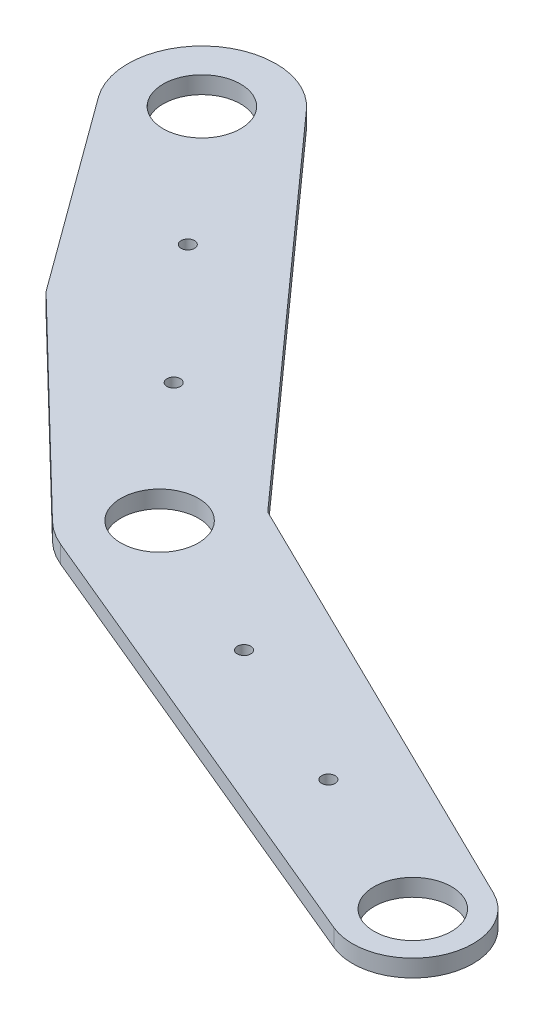
ISO-10303-21;
HEADER;
FILE_DESCRIPTION(('STEP AP214'),'2;1');
FILE_NAME('part.step','',(''),(''),'','','');
FILE_SCHEMA(('AUTOMOTIVE_DESIGN { 1 0 10303 214 1 1 1 1 }'));
ENDSEC;
DATA;
#1=APPLICATION_CONTEXT('core data for automotive mechanical design processes');
#2=APPLICATION_PROTOCOL_DEFINITION('international standard','automotive_design',2000,#1);
#3=PRODUCT_CONTEXT('',#1,'mechanical');
#4=PRODUCT('Part','Part','',(#3));
#5=PRODUCT_RELATED_PRODUCT_CATEGORY('part','',(#4));
#6=PRODUCT_DEFINITION_FORMATION('','',#4);
#7=PRODUCT_DEFINITION_CONTEXT('part definition',#1,'design');
#8=PRODUCT_DEFINITION('design','',#6,#7);
#9=PRODUCT_DEFINITION_SHAPE('','',#8);
#10=(LENGTH_UNIT() NAMED_UNIT(*) SI_UNIT(.MILLI.,.METRE.));
#11=(NAMED_UNIT(*) PLANE_ANGLE_UNIT() SI_UNIT($,.RADIAN.));
#12=(NAMED_UNIT(*) SI_UNIT($,.STERADIAN.) SOLID_ANGLE_UNIT());
#13=UNCERTAINTY_MEASURE_WITH_UNIT(LENGTH_MEASURE(1.E-05),#10,'distance_accuracy_value','');
#14=(GEOMETRIC_REPRESENTATION_CONTEXT(3) GLOBAL_UNCERTAINTY_ASSIGNED_CONTEXT((#13)) GLOBAL_UNIT_ASSIGNED_CONTEXT((#10,
#11,#12)) REPRESENTATION_CONTEXT('',''));
#15=CARTESIAN_POINT('',(0.,0.,0.));
#16=DIRECTION('',(0.,0.,1.));
#17=DIRECTION('',(1.,0.,0.));
#18=AXIS2_PLACEMENT_3D('',#15,#16,#17);
#19=CARTESIAN_POINT('',(75.095230672892,6.35,34.29));
#20=DIRECTION('',(0.,1.,0.));
#21=DIRECTION('',(0.,0.,1.));
#22=AXIS2_PLACEMENT_3D('',#19,#20,#21);
#23=PLANE('',#22);
#24=CARTESIAN_POINT('',(158.10251971021,6.35,127.69346365907));
#25=DIRECTION('',(0.,1.,0.));
#26=DIRECTION('',(0.,0.,1.));
#27=AXIS2_PLACEMENT_3D('',#24,#25,#26);
#28=CIRCLE('',#27,2.48919999999997);
#29=CARTESIAN_POINT('',(158.10251971021,6.35,130.18266365907));
#30=VERTEX_POINT('',#29);
#31=EDGE_CURVE('E424',#30,#30,#28,.T.);
#32=ORIENTED_EDGE('',*,*,#31,.F.);
#33=EDGE_LOOP('',(#32));
#34=FACE_BOUND('',#33,.T.);
#35=CARTESIAN_POINT('',(313.427710588494,6.35,225.96140300338));
#36=DIRECTION('',(0.,1.,0.));
#37=DIRECTION('',(0.,0.,1.));
#38=AXIS2_PLACEMENT_3D('',#35,#36,#37);
#39=CIRCLE('',#38,2.48920000000001);
#40=CARTESIAN_POINT('',(313.427710588494,6.35,228.45060300338));
#41=VERTEX_POINT('',#40);
#42=EDGE_CURVE('E436',#41,#41,#39,.T.);
#43=ORIENTED_EDGE('',*,*,#42,.F.);
#44=EDGE_LOOP('',(#43));
#45=FACE_BOUND('',#44,.T.);
#46=CARTESIAN_POINT('',(199.606167476883,6.35,174.395199143412));
#47=DIRECTION('',(0.,1.,0.));
#48=DIRECTION('',(0.,0.,1.));
#49=AXIS2_PLACEMENT_3D('',#46,#47,#48);
#50=CIRCLE('',#49,14.2875);
#51=CARTESIAN_POINT('',(199.606167476883,6.35,188.682699143413));
#52=VERTEX_POINT('',#51);
#53=EDGE_CURVE('E448',#52,#52,#50,.T.);
#54=ORIENTED_EDGE('',*,*,#53,.F.);
#55=EDGE_LOOP('',(#54));
#56=FACE_BOUND('',#55,.T.);
#57=CARTESIAN_POINT('',(75.095230672892,6.35,34.29));
#58=DIRECTION('',(0.,1.,0.));
#59=DIRECTION('',(0.,0.,1.));
#60=AXIS2_PLACEMENT_3D('',#57,#58,#59);
#61=CIRCLE('',#60,27.305);
#62=CARTESIAN_POINT('',(95.4436302013595,6.35,16.0827030663565));
#63=VERTEX_POINT('',#62);
#64=CARTESIAN_POINT('',(53.0501244379253,6.35,50.4013722596504));
#65=VERTEX_POINT('',#64);
#66=EDGE_CURVE('E283',#63,#65,#61,.T.);
#67=ORIENTED_EDGE('',*,*,#66,.T.);
#68=DIRECTION('',(-0.590052087883187,0.,-0.807365179819325));
#69=VECTOR('',#68,1.);
#70=CARTESIAN_POINT('',(105.505755050741,6.35,122.176136745588));
#71=LINE('',#70,#69);
#72=CARTESIAN_POINT('',(105.505755050741,6.35,122.176136745588));
#73=VERTEX_POINT('',#72);
#74=EDGE_CURVE('E365',#73,#65,#71,.T.);
#75=ORIENTED_EDGE('',*,*,#74,.F.);
#76=DIRECTION('',(0.718432921931401,0.,0.6955962454507));
#77=VECTOR('',#76,1.);
#78=CARTESIAN_POINT('',(105.505755050741,6.35,122.176136745588));
#79=LINE('',#78,#77);
#80=CARTESIAN_POINT('',(180.17120837899,6.35,194.468214982176));
#81=VERTEX_POINT('',#80);
#82=EDGE_CURVE('E355',#73,#81,#79,.T.);
#83=ORIENTED_EDGE('',*,*,#82,.T.);
#84=CARTESIAN_POINT('',(199.606167476883,6.35,174.395199143412));
#85=DIRECTION('',(0.,1.,0.));
#86=DIRECTION('',(0.,0.,1.));
#87=AXIS2_PLACEMENT_3D('',#84,#85,#86);
#88=CIRCLE('',#87,27.94);
#89=CARTESIAN_POINT('',(188.857524144362,6.35,200.18493094718));
#90=VERTEX_POINT('',#89);
#91=EDGE_CURVE('E461',#81,#90,#88,.T.);
#92=ORIENTED_EDGE('',*,*,#91,.T.);
#93=DIRECTION('',(0.923039792547152,0.,0.384704485773834));
#94=VECTOR('',#93,1.);
#95=CARTESIAN_POINT('',(188.857524144362,6.35,200.18493094718));
#96=LINE('',#95,#94);
#97=CARTESIAN_POINT('',(361.788429401728,6.35,272.259066340471));
#98=VERTEX_POINT('',#97);
#99=EDGE_CURVE('E304',#90,#98,#96,.T.);
#100=ORIENTED_EDGE('',*,*,#99,.T.);
#101=CARTESIAN_POINT('',(370.338486598052,6.35,251.744506951111));
#102=DIRECTION('',(0.,1.,0.));
#103=DIRECTION('',(0.,0.,1.));
#104=AXIS2_PLACEMENT_3D('',#101,#102,#103);
#105=CIRCLE('',#104,22.225);
#106=CARTESIAN_POINT('',(380.123056101168,6.35,231.789236353128));
#107=VERTEX_POINT('',#106);
#108=EDGE_CURVE('E298',#98,#107,#105,.T.);
#109=ORIENTED_EDGE('',*,*,#108,.T.);
#110=DIRECTION('',(-0.897874942541384,0.,-0.440250596315674));
#111=VECTOR('',#110,1.);
#112=CARTESIAN_POINT('',(380.123056101168,6.35,231.789236353128));
#113=LINE('',#112,#111);
#114=CARTESIAN_POINT('',(216.796442467324,6.35,151.706102678635));
#115=VERTEX_POINT('',#114);
#116=EDGE_CURVE('E302',#107,#115,#113,.T.);
#117=ORIENTED_EDGE('',*,*,#116,.T.);
#118=DIRECTION('',(0.666811826905092,0.,0.745226131787858));
#119=VECTOR('',#118,1.);
#120=CARTESIAN_POINT('',(95.4436302013595,6.35,16.0827030663565));
#121=LINE('',#120,#119);
#122=EDGE_CURVE('E319',#63,#115,#121,.T.);
#123=ORIENTED_EDGE('',*,*,#122,.F.);
#124=EDGE_LOOP('',(#67,#75,#83,#92,#100,#109,#117,#123));
#125=FACE_BOUND('',#124,.T.);
#126=CARTESIAN_POINT('',(75.095230672892,6.35,34.29));
#127=DIRECTION('',(0.,1.,0.));
#128=DIRECTION('',(0.,0.,1.));
#129=AXIS2_PLACEMENT_3D('',#126,#127,#128);
#130=CIRCLE('',#129,14.2875);
#131=CARTESIAN_POINT('',(75.095230672892,6.35,48.5775));
#132=VERTEX_POINT('',#131);
#133=EDGE_CURVE('E327',#132,#132,#130,.T.);
#134=ORIENTED_EDGE('',*,*,#133,.F.);
#135=EDGE_LOOP('',(#134));
#136=FACE_BOUND('',#135,.T.);
#137=CARTESIAN_POINT('',(370.338486598052,6.35,251.744506951111));
#138=DIRECTION('',(0.,1.,0.));
#139=DIRECTION('',(0.,0.,1.));
#140=AXIS2_PLACEMENT_3D('',#137,#138,#139);
#141=CIRCLE('',#140,14.2875000000001);
#142=CARTESIAN_POINT('',(370.338486598052,6.35,266.032006951111));
#143=VERTEX_POINT('',#142);
#144=EDGE_CURVE('E442',#143,#143,#141,.T.);
#145=ORIENTED_EDGE('',*,*,#144,.F.);
#146=EDGE_LOOP('',(#145));
#147=FACE_BOUND('',#146,.T.);
#148=CARTESIAN_POINT('',(256.516951121444,6.35,200.178306550138));
#149=DIRECTION('',(0.,1.,0.));
#150=DIRECTION('',(0.,0.,1.));
#151=AXIS2_PLACEMENT_3D('',#148,#149,#150);
#152=CIRCLE('',#151,2.48920000000001);
#153=CARTESIAN_POINT('',(256.516951121444,6.35,202.667506550138));
#154=VERTEX_POINT('',#153);
#155=EDGE_CURVE('E430',#154,#154,#152,.T.);
#156=ORIENTED_EDGE('',*,*,#155,.F.);
#157=EDGE_LOOP('',(#156));
#158=FACE_BOUND('',#157,.T.);
#159=CARTESIAN_POINT('',(116.598878439564,6.35,80.9917354843427));
#160=DIRECTION('',(0.,1.,0.));
#161=DIRECTION('',(0.,0.,1.));
#162=AXIS2_PLACEMENT_3D('',#159,#160,#161);
#163=CIRCLE('',#162,2.4892);
#164=CARTESIAN_POINT('',(116.598878439564,6.35,83.4809354843427));
#165=VERTEX_POINT('',#164);
#166=EDGE_CURVE('E415',#165,#165,#163,.T.);
#167=ORIENTED_EDGE('',*,*,#166,.F.);
#168=EDGE_LOOP('',(#167));
#169=FACE_BOUND('',#168,.T.);
#170=ADVANCED_FACE('F228',(#34,#45,#56,#125,#136,#147,#158,#169),#23,.T.);
#171=CARTESIAN_POINT('',(75.095230672892,0.,34.29));
#172=DIRECTION('',(0.,1.,0.));
#173=DIRECTION('',(0.,0.,1.));
#174=AXIS2_PLACEMENT_3D('',#171,#172,#173);
#175=PLANE('',#174);
#176=CARTESIAN_POINT('',(75.095230672892,0.,34.29));
#177=DIRECTION('',(0.,1.,0.));
#178=DIRECTION('',(0.,0.,1.));
#179=AXIS2_PLACEMENT_3D('',#176,#177,#178);
#180=CIRCLE('',#179,27.305);
#181=CARTESIAN_POINT('',(95.4436302013595,0.,16.0827030663565));
#182=VERTEX_POINT('',#181);
#183=CARTESIAN_POINT('',(53.0501244379253,0.,50.4013722596504));
#184=VERTEX_POINT('',#183);
#185=EDGE_CURVE('E324',#182,#184,#180,.T.);
#186=ORIENTED_EDGE('',*,*,#185,.F.);
#187=DIRECTION('',(0.666811826905092,0.,0.745226131787858));
#188=VECTOR('',#187,1.);
#189=CARTESIAN_POINT('',(95.4436302013595,0.,16.0827030663565));
#190=LINE('',#189,#188);
#191=CARTESIAN_POINT('',(216.796442467324,0.,151.706102678635));
#192=VERTEX_POINT('',#191);
#193=EDGE_CURVE('E339',#182,#192,#190,.T.);
#194=ORIENTED_EDGE('',*,*,#193,.T.);
#195=DIRECTION('',(-0.897874942541384,0.,-0.440250596315674));
#196=VECTOR('',#195,1.);
#197=CARTESIAN_POINT('',(380.123056101168,0.,231.789236353128));
#198=LINE('',#197,#196);
#199=CARTESIAN_POINT('',(380.123056101168,0.,231.789236353128));
#200=VERTEX_POINT('',#199);
#201=EDGE_CURVE('E337',#200,#192,#198,.T.);
#202=ORIENTED_EDGE('',*,*,#201,.F.);
#203=CARTESIAN_POINT('',(370.338486598052,0.,251.744506951111));
#204=DIRECTION('',(0.,1.,0.));
#205=DIRECTION('',(0.,0.,1.));
#206=AXIS2_PLACEMENT_3D('',#203,#204,#205);
#207=CIRCLE('',#206,22.225);
#208=CARTESIAN_POINT('',(361.788429401728,0.,272.259066340471));
#209=VERTEX_POINT('',#208);
#210=EDGE_CURVE('E313',#209,#200,#207,.T.);
#211=ORIENTED_EDGE('',*,*,#210,.F.);
#212=DIRECTION('',(0.923039792547152,0.,0.384704485773834));
#213=VECTOR('',#212,1.);
#214=CARTESIAN_POINT('',(188.857524144362,0.,200.18493094718));
#215=LINE('',#214,#213);
#216=CARTESIAN_POINT('',(188.857524144362,0.,200.18493094718));
#217=VERTEX_POINT('',#216);
#218=EDGE_CURVE('E334',#217,#209,#215,.T.);
#219=ORIENTED_EDGE('',*,*,#218,.F.);
#220=CARTESIAN_POINT('',(199.606167476883,0.,174.395199143412));
#221=DIRECTION('',(0.,1.,0.));
#222=DIRECTION('',(0.,0.,1.));
#223=AXIS2_PLACEMENT_3D('',#220,#221,#222);
#224=CIRCLE('',#223,27.94);
#225=CARTESIAN_POINT('',(180.17120837899,0.,194.468214982176));
#226=VERTEX_POINT('',#225);
#227=EDGE_CURVE('E332',#226,#217,#224,.T.);
#228=ORIENTED_EDGE('',*,*,#227,.F.);
#229=DIRECTION('',(0.718432921931401,0.,0.6955962454507));
#230=VECTOR('',#229,1.);
#231=CARTESIAN_POINT('',(105.505755050741,0.,122.176136745588));
#232=LINE('',#231,#230);
#233=CARTESIAN_POINT('',(105.505755050741,0.,122.176136745588));
#234=VERTEX_POINT('',#233);
#235=EDGE_CURVE('E330',#234,#226,#232,.T.);
#236=ORIENTED_EDGE('',*,*,#235,.F.);
#237=DIRECTION('',(-0.590052087883187,0.,-0.807365179819325));
#238=VECTOR('',#237,1.);
#239=CARTESIAN_POINT('',(105.505755050741,0.,122.176136745588));
#240=LINE('',#239,#238);
#241=EDGE_CURVE('E326',#234,#184,#240,.T.);
#242=ORIENTED_EDGE('',*,*,#241,.T.);
#243=EDGE_LOOP('',(#186,#194,#202,#211,#219,#228,#236,#242));
#244=FACE_BOUND('',#243,.T.);
#245=CARTESIAN_POINT('',(75.095230672892,0.,34.29));
#246=DIRECTION('',(0.,1.,0.));
#247=DIRECTION('',(0.,0.,1.));
#248=AXIS2_PLACEMENT_3D('',#245,#246,#247);
#249=CIRCLE('',#248,14.2875);
#250=CARTESIAN_POINT('',(75.095230672892,0.,48.5775));
#251=VERTEX_POINT('',#250);
#252=EDGE_CURVE('E451',#251,#251,#249,.T.);
#253=ORIENTED_EDGE('',*,*,#252,.T.);
#254=EDGE_LOOP('',(#253));
#255=FACE_BOUND('',#254,.T.);
#256=CARTESIAN_POINT('',(199.606167476883,0.,174.395199143412));
#257=DIRECTION('',(0.,1.,0.));
#258=DIRECTION('',(0.,0.,1.));
#259=AXIS2_PLACEMENT_3D('',#256,#257,#258);
#260=CIRCLE('',#259,14.2875);
#261=CARTESIAN_POINT('',(199.606167476883,0.,188.682699143413));
#262=VERTEX_POINT('',#261);
#263=EDGE_CURVE('E445',#262,#262,#260,.T.);
#264=ORIENTED_EDGE('',*,*,#263,.T.);
#265=EDGE_LOOP('',(#264));
#266=FACE_BOUND('',#265,.T.);
#267=CARTESIAN_POINT('',(370.338486598052,0.,251.744506951111));
#268=DIRECTION('',(0.,1.,0.));
#269=DIRECTION('',(0.,0.,1.));
#270=AXIS2_PLACEMENT_3D('',#267,#268,#269);
#271=CIRCLE('',#270,14.2875000000001);
#272=CARTESIAN_POINT('',(370.338486598052,0.,266.032006951111));
#273=VERTEX_POINT('',#272);
#274=EDGE_CURVE('E439',#273,#273,#271,.T.);
#275=ORIENTED_EDGE('',*,*,#274,.T.);
#276=EDGE_LOOP('',(#275));
#277=FACE_BOUND('',#276,.T.);
#278=CARTESIAN_POINT('',(313.427710588494,0.,225.96140300338));
#279=DIRECTION('',(0.,1.,0.));
#280=DIRECTION('',(0.,0.,1.));
#281=AXIS2_PLACEMENT_3D('',#278,#279,#280);
#282=CIRCLE('',#281,2.48920000000001);
#283=CARTESIAN_POINT('',(313.427710588494,0.,228.45060300338));
#284=VERTEX_POINT('',#283);
#285=EDGE_CURVE('E433',#284,#284,#282,.T.);
#286=ORIENTED_EDGE('',*,*,#285,.T.);
#287=EDGE_LOOP('',(#286));
#288=FACE_BOUND('',#287,.T.);
#289=CARTESIAN_POINT('',(256.516951121444,0.,200.178306550138));
#290=DIRECTION('',(0.,1.,0.));
#291=DIRECTION('',(0.,0.,1.));
#292=AXIS2_PLACEMENT_3D('',#289,#290,#291);
#293=CIRCLE('',#292,2.48920000000001);
#294=CARTESIAN_POINT('',(256.516951121444,0.,202.667506550138));
#295=VERTEX_POINT('',#294);
#296=EDGE_CURVE('E427',#295,#295,#293,.T.);
#297=ORIENTED_EDGE('',*,*,#296,.T.);
#298=EDGE_LOOP('',(#297));
#299=FACE_BOUND('',#298,.T.);
#300=CARTESIAN_POINT('',(158.10251971021,0.,127.69346365907));
#301=DIRECTION('',(0.,1.,0.));
#302=DIRECTION('',(0.,0.,1.));
#303=AXIS2_PLACEMENT_3D('',#300,#301,#302);
#304=CIRCLE('',#303,2.48919999999997);
#305=CARTESIAN_POINT('',(158.10251971021,0.,130.18266365907));
#306=VERTEX_POINT('',#305);
#307=EDGE_CURVE('E421',#306,#306,#304,.T.);
#308=ORIENTED_EDGE('',*,*,#307,.T.);
#309=EDGE_LOOP('',(#308));
#310=FACE_BOUND('',#309,.T.);
#311=CARTESIAN_POINT('',(116.598878439564,0.,80.9917354843427));
#312=DIRECTION('',(0.,1.,0.));
#313=DIRECTION('',(0.,0.,1.));
#314=AXIS2_PLACEMENT_3D('',#311,#312,#313);
#315=CIRCLE('',#314,2.4892);
#316=CARTESIAN_POINT('',(116.598878439564,0.,83.4809354843427));
#317=VERTEX_POINT('',#316);
#318=EDGE_CURVE('E418',#317,#317,#315,.T.);
#319=ORIENTED_EDGE('',*,*,#318,.T.);
#320=EDGE_LOOP('',(#319));
#321=FACE_BOUND('',#320,.T.);
#322=ADVANCED_FACE('F361',(#244,#255,#266,#277,#288,#299,#310,#321),#175,.F.);
#323=CARTESIAN_POINT('',(75.095230672892,6.35,34.29));
#324=DIRECTION('',(0.,-1.,0.));
#325=DIRECTION('',(0.,0.,-1.));
#326=AXIS2_PLACEMENT_3D('',#323,#324,#325);
#327=CYLINDRICAL_SURFACE('',#326,27.305);
#328=ORIENTED_EDGE('',*,*,#185,.T.);
#329=DIRECTION('',(0.,-1.,0.));
#330=VECTOR('',#329,1.);
#331=CARTESIAN_POINT('',(53.0501244379253,6.35,50.4013722596504));
#332=LINE('',#331,#330);
#333=EDGE_CURVE('E12',#65,#184,#332,.T.);
#334=ORIENTED_EDGE('',*,*,#333,.F.);
#335=ORIENTED_EDGE('',*,*,#66,.F.);
#336=DIRECTION('',(0.,-1.,0.));
#337=VECTOR('',#336,1.);
#338=CARTESIAN_POINT('',(95.4436302013595,6.35,16.0827030663565));
#339=LINE('',#338,#337);
#340=EDGE_CURVE('E245',#63,#182,#339,.T.);
#341=ORIENTED_EDGE('',*,*,#340,.T.);
#342=EDGE_LOOP('',(#328,#334,#335,#341));
#343=FACE_BOUND('',#342,.T.);
#344=ADVANCED_FACE('F230',(#343),#327,.T.);
#345=CARTESIAN_POINT('',(105.505755050741,6.35,122.176136745588));
#346=DIRECTION('',(-0.807365179819325,0.,0.590052087883187));
#347=DIRECTION('',(0.590052087883187,0.,0.807365179819325));
#348=AXIS2_PLACEMENT_3D('',#345,#346,#347);
#349=PLANE('',#348);
#350=ORIENTED_EDGE('',*,*,#241,.F.);
#351=DIRECTION('',(0.,-1.,0.));
#352=VECTOR('',#351,1.);
#353=CARTESIAN_POINT('',(105.505755050741,6.35,122.176136745588));
#354=LINE('',#353,#352);
#355=EDGE_CURVE('E237',#73,#234,#354,.T.);
#356=ORIENTED_EDGE('',*,*,#355,.F.);
#357=ORIENTED_EDGE('',*,*,#74,.T.);
#358=ORIENTED_EDGE('',*,*,#333,.T.);
#359=EDGE_LOOP('',(#350,#356,#357,#358));
#360=FACE_BOUND('',#359,.T.);
#361=ADVANCED_FACE('F364',(#360),#349,.T.);
#362=CARTESIAN_POINT('',(105.505755050741,6.35,122.176136745588));
#363=DIRECTION('',(0.6955962454507,0.,-0.7184329219314));
#364=DIRECTION('',(-0.7184329219314,0.,-0.6955962454507));
#365=AXIS2_PLACEMENT_3D('',#362,#363,#364);
#366=PLANE('',#365);
#367=ORIENTED_EDGE('',*,*,#235,.T.);
#368=DIRECTION('',(0.,-1.,0.));
#369=VECTOR('',#368,1.);
#370=CARTESIAN_POINT('',(180.17120837899,6.35,194.468214982176));
#371=LINE('',#370,#369);
#372=EDGE_CURVE('E348',#81,#226,#371,.T.);
#373=ORIENTED_EDGE('',*,*,#372,.F.);
#374=ORIENTED_EDGE('',*,*,#82,.F.);
#375=ORIENTED_EDGE('',*,*,#355,.T.);
#376=EDGE_LOOP('',(#367,#373,#374,#375));
#377=FACE_BOUND('',#376,.T.);
#378=ADVANCED_FACE('F353',(#377),#366,.F.);
#379=CARTESIAN_POINT('',(199.606167476883,6.35,174.395199143412));
#380=DIRECTION('',(0.,-1.,0.));
#381=DIRECTION('',(0.,0.,-1.));
#382=AXIS2_PLACEMENT_3D('',#379,#380,#381);
#383=CYLINDRICAL_SURFACE('',#382,27.94);
#384=ORIENTED_EDGE('',*,*,#227,.T.);
#385=DIRECTION('',(0.,-1.,0.));
#386=VECTOR('',#385,1.);
#387=CARTESIAN_POINT('',(188.857524144362,6.35,200.18493094718));
#388=LINE('',#387,#386);
#389=EDGE_CURVE('E345',#90,#217,#388,.T.);
#390=ORIENTED_EDGE('',*,*,#389,.F.);
#391=ORIENTED_EDGE('',*,*,#91,.F.);
#392=ORIENTED_EDGE('',*,*,#372,.T.);
#393=EDGE_LOOP('',(#384,#390,#391,#392));
#394=FACE_BOUND('',#393,.T.);
#395=ADVANCED_FACE('F465',(#394),#383,.T.);
#396=CARTESIAN_POINT('',(188.857524144362,6.35,200.18493094718));
#397=DIRECTION('',(0.384704485773834,0.,-0.923039792547152));
#398=DIRECTION('',(-0.923039792547152,0.,-0.384704485773834));
#399=AXIS2_PLACEMENT_3D('',#396,#397,#398);
#400=PLANE('',#399);
#401=ORIENTED_EDGE('',*,*,#218,.T.);
#402=DIRECTION('',(0.,-1.,0.));
#403=VECTOR('',#402,1.);
#404=CARTESIAN_POINT('',(361.788429401728,6.35,272.259066340471));
#405=LINE('',#404,#403);
#406=EDGE_CURVE('E316',#98,#209,#405,.T.);
#407=ORIENTED_EDGE('',*,*,#406,.F.);
#408=ORIENTED_EDGE('',*,*,#99,.F.);
#409=ORIENTED_EDGE('',*,*,#389,.T.);
#410=EDGE_LOOP('',(#401,#407,#408,#409));
#411=FACE_BOUND('',#410,.T.);
#412=ADVANCED_FACE('F467',(#411),#400,.F.);
#413=CARTESIAN_POINT('',(370.338486598052,6.35,251.744506951111));
#414=DIRECTION('',(0.,-1.,0.));
#415=DIRECTION('',(0.,0.,-1.));
#416=AXIS2_PLACEMENT_3D('',#413,#414,#415);
#417=CYLINDRICAL_SURFACE('',#416,22.225);
#418=ORIENTED_EDGE('',*,*,#210,.T.);
#419=DIRECTION('',(0.,-1.,0.));
#420=VECTOR('',#419,1.);
#421=CARTESIAN_POINT('',(380.123056101168,6.35,231.789236353128));
#422=LINE('',#421,#420);
#423=EDGE_CURVE('E310',#107,#200,#422,.T.);
#424=ORIENTED_EDGE('',*,*,#423,.F.);
#425=ORIENTED_EDGE('',*,*,#108,.F.);
#426=ORIENTED_EDGE('',*,*,#406,.T.);
#427=EDGE_LOOP('',(#418,#424,#425,#426));
#428=FACE_BOUND('',#427,.T.);
#429=ADVANCED_FACE('F311',(#428),#417,.T.);
#430=CARTESIAN_POINT('',(380.123056101168,6.35,231.789236353128));
#431=DIRECTION('',(-0.440250596315674,0.,0.897874942541384));
#432=DIRECTION('',(0.897874942541384,0.,0.440250596315674));
#433=AXIS2_PLACEMENT_3D('',#430,#431,#432);
#434=PLANE('',#433);
#435=ORIENTED_EDGE('',*,*,#201,.T.);
#436=DIRECTION('',(0.,-1.,0.));
#437=VECTOR('',#436,1.);
#438=CARTESIAN_POINT('',(216.796442467324,6.35,151.706102678635));
#439=LINE('',#438,#437);
#440=EDGE_CURVE('E271',#115,#192,#439,.T.);
#441=ORIENTED_EDGE('',*,*,#440,.F.);
#442=ORIENTED_EDGE('',*,*,#116,.F.);
#443=ORIENTED_EDGE('',*,*,#423,.T.);
#444=EDGE_LOOP('',(#435,#441,#442,#443));
#445=FACE_BOUND('',#444,.T.);
#446=ADVANCED_FACE('F318',(#445),#434,.F.);
#447=CARTESIAN_POINT('',(95.4436302013595,6.35,16.0827030663565));
#448=DIRECTION('',(0.745226131787858,0.,-0.666811826905092));
#449=DIRECTION('',(-0.666811826905092,0.,-0.745226131787858));
#450=AXIS2_PLACEMENT_3D('',#447,#448,#449);
#451=PLANE('',#450);
#452=ORIENTED_EDGE('',*,*,#193,.F.);
#453=ORIENTED_EDGE('',*,*,#340,.F.);
#454=ORIENTED_EDGE('',*,*,#122,.T.);
#455=ORIENTED_EDGE('',*,*,#440,.T.);
#456=EDGE_LOOP('',(#452,#453,#454,#455));
#457=FACE_BOUND('',#456,.T.);
#458=ADVANCED_FACE('F366',(#457),#451,.T.);
#459=CARTESIAN_POINT('',(75.095230672892,6.35,34.29));
#460=DIRECTION('',(0.,-1.,0.));
#461=DIRECTION('',(0.,0.,-1.));
#462=AXIS2_PLACEMENT_3D('',#459,#460,#461);
#463=CYLINDRICAL_SURFACE('',#462,14.2875);
#464=ORIENTED_EDGE('',*,*,#133,.T.);
#465=EDGE_LOOP('',(#464));
#466=FACE_BOUND('',#465,.T.);
#467=ORIENTED_EDGE('',*,*,#252,.F.);
#468=EDGE_LOOP('',(#467));
#469=FACE_BOUND('',#468,.T.);
#470=ADVANCED_FACE('F368',(#466,#469),#463,.F.);
#471=CARTESIAN_POINT('',(199.606167476883,6.35,174.395199143412));
#472=DIRECTION('',(0.,-1.,0.));
#473=DIRECTION('',(0.,0.,-1.));
#474=AXIS2_PLACEMENT_3D('',#471,#472,#473);
#475=CYLINDRICAL_SURFACE('',#474,14.2875);
#476=ORIENTED_EDGE('',*,*,#53,.T.);
#477=EDGE_LOOP('',(#476));
#478=FACE_BOUND('',#477,.T.);
#479=ORIENTED_EDGE('',*,*,#263,.F.);
#480=EDGE_LOOP('',(#479));
#481=FACE_BOUND('',#480,.T.);
#482=ADVANCED_FACE('F374',(#478,#481),#475,.F.);
#483=CARTESIAN_POINT('',(370.338486598052,6.35,251.744506951111));
#484=DIRECTION('',(0.,-1.,0.));
#485=DIRECTION('',(0.,0.,-1.));
#486=AXIS2_PLACEMENT_3D('',#483,#484,#485);
#487=CYLINDRICAL_SURFACE('',#486,14.2875000000001);
#488=ORIENTED_EDGE('',*,*,#144,.T.);
#489=EDGE_LOOP('',(#488));
#490=FACE_BOUND('',#489,.T.);
#491=ORIENTED_EDGE('',*,*,#274,.F.);
#492=EDGE_LOOP('',(#491));
#493=FACE_BOUND('',#492,.T.);
#494=ADVANCED_FACE('F390',(#490,#493),#487,.F.);
#495=CARTESIAN_POINT('',(313.427710588494,6.35,225.96140300338));
#496=DIRECTION('',(0.,-1.,0.));
#497=DIRECTION('',(0.,0.,-1.));
#498=AXIS2_PLACEMENT_3D('',#495,#496,#497);
#499=CYLINDRICAL_SURFACE('',#498,2.48920000000001);
#500=ORIENTED_EDGE('',*,*,#42,.T.);
#501=EDGE_LOOP('',(#500));
#502=FACE_BOUND('',#501,.T.);
#503=ORIENTED_EDGE('',*,*,#285,.F.);
#504=EDGE_LOOP('',(#503));
#505=FACE_BOUND('',#504,.T.);
#506=ADVANCED_FACE('F394',(#502,#505),#499,.F.);
#507=CARTESIAN_POINT('',(256.516951121444,6.35,200.178306550138));
#508=DIRECTION('',(0.,-1.,0.));
#509=DIRECTION('',(0.,0.,-1.));
#510=AXIS2_PLACEMENT_3D('',#507,#508,#509);
#511=CYLINDRICAL_SURFACE('',#510,2.48920000000001);
#512=ORIENTED_EDGE('',*,*,#155,.T.);
#513=EDGE_LOOP('',(#512));
#514=FACE_BOUND('',#513,.T.);
#515=ORIENTED_EDGE('',*,*,#296,.F.);
#516=EDGE_LOOP('',(#515));
#517=FACE_BOUND('',#516,.T.);
#518=ADVANCED_FACE('F398',(#514,#517),#511,.F.);
#519=CARTESIAN_POINT('',(158.10251971021,6.35,127.69346365907));
#520=DIRECTION('',(0.,-1.,0.));
#521=DIRECTION('',(0.,0.,-1.));
#522=AXIS2_PLACEMENT_3D('',#519,#520,#521);
#523=CYLINDRICAL_SURFACE('',#522,2.48919999999997);
#524=ORIENTED_EDGE('',*,*,#31,.T.);
#525=EDGE_LOOP('',(#524));
#526=FACE_BOUND('',#525,.T.);
#527=ORIENTED_EDGE('',*,*,#307,.F.);
#528=EDGE_LOOP('',(#527));
#529=FACE_BOUND('',#528,.T.);
#530=ADVANCED_FACE('F402',(#526,#529),#523,.F.);
#531=CARTESIAN_POINT('',(116.598878439564,6.35,80.9917354843427));
#532=DIRECTION('',(0.,-1.,0.));
#533=DIRECTION('',(0.,0.,-1.));
#534=AXIS2_PLACEMENT_3D('',#531,#532,#533);
#535=CYLINDRICAL_SURFACE('',#534,2.4892);
#536=ORIENTED_EDGE('',*,*,#166,.T.);
#537=EDGE_LOOP('',(#536));
#538=FACE_BOUND('',#537,.T.);
#539=ORIENTED_EDGE('',*,*,#318,.F.);
#540=EDGE_LOOP('',(#539));
#541=FACE_BOUND('',#540,.T.);
#542=ADVANCED_FACE('F406',(#538,#541),#535,.F.);
#543=CLOSED_SHELL('',(#170,#322,#344,#361,#378,#395,#412,#429,#446,#458,#470,#482,#494,#506,
#518,#530,#542));
#544=MANIFOLD_SOLID_BREP('B2',#543);
#545=ADVANCED_BREP_SHAPE_REPRESENTATION('',(#18,#544),#14);
#546=SHAPE_DEFINITION_REPRESENTATION(#9,#545);
ENDSEC;
END-ISO-10303-21;
